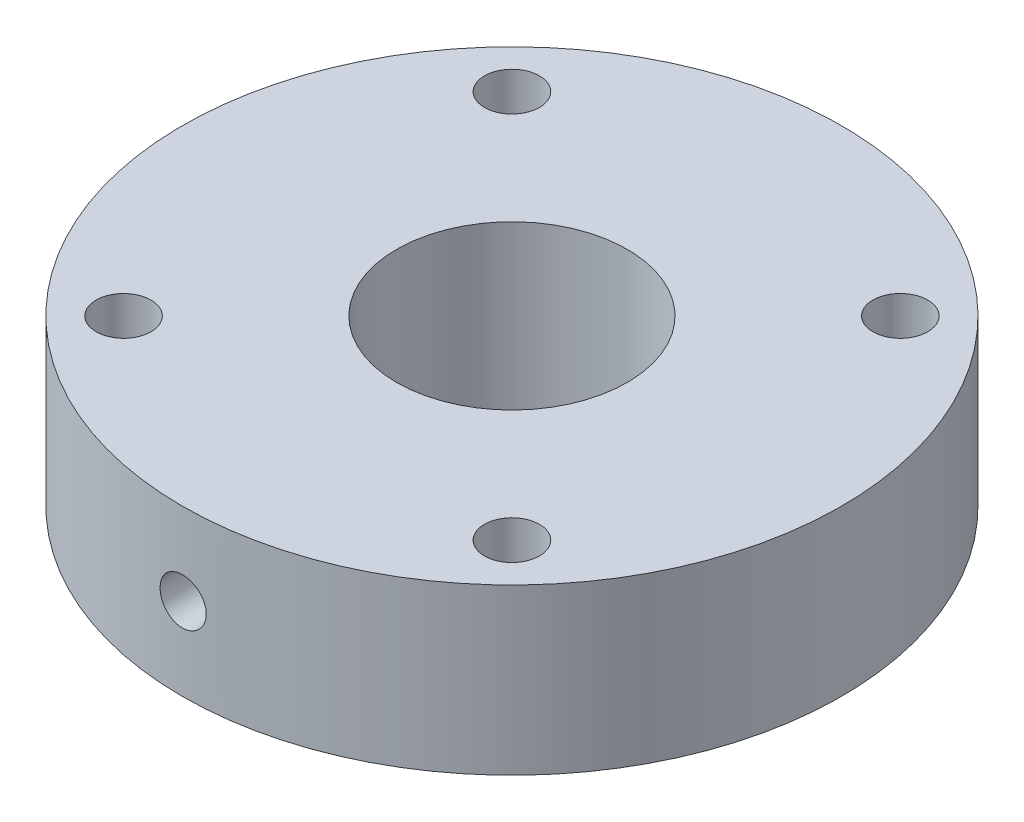
ISO-10303-21;
HEADER;
FILE_DESCRIPTION(('STEP AP214'),'2;1');
FILE_NAME('part.step','',(''),(''),'','','');
FILE_SCHEMA(('AUTOMOTIVE_DESIGN { 1 0 10303 214 1 1 1 1 }'));
ENDSEC;
DATA;
#1=APPLICATION_CONTEXT('core data for automotive mechanical design processes');
#2=APPLICATION_PROTOCOL_DEFINITION('international standard','automotive_design',2000,#1);
#3=PRODUCT_CONTEXT('',#1,'mechanical');
#4=PRODUCT('Part','Part','',(#3));
#5=PRODUCT_RELATED_PRODUCT_CATEGORY('part','',(#4));
#6=PRODUCT_DEFINITION_FORMATION('','',#4);
#7=PRODUCT_DEFINITION_CONTEXT('part definition',#1,'design');
#8=PRODUCT_DEFINITION('design','',#6,#7);
#9=PRODUCT_DEFINITION_SHAPE('','',#8);
#10=(LENGTH_UNIT() NAMED_UNIT(*) SI_UNIT(.MILLI.,.METRE.));
#11=(NAMED_UNIT(*) PLANE_ANGLE_UNIT() SI_UNIT($,.RADIAN.));
#12=(NAMED_UNIT(*) SI_UNIT($,.STERADIAN.) SOLID_ANGLE_UNIT());
#13=UNCERTAINTY_MEASURE_WITH_UNIT(LENGTH_MEASURE(1.E-05),#10,'distance_accuracy_value','');
#14=(GEOMETRIC_REPRESENTATION_CONTEXT(3) GLOBAL_UNCERTAINTY_ASSIGNED_CONTEXT((#13)) GLOBAL_UNIT_ASSIGNED_CONTEXT((#10,
#11,#12)) REPRESENTATION_CONTEXT('',''));
#15=CARTESIAN_POINT('',(0.,0.,0.));
#16=DIRECTION('',(0.,0.,1.));
#17=DIRECTION('',(1.,0.,0.));
#18=AXIS2_PLACEMENT_3D('',#15,#16,#17);
#19=CARTESIAN_POINT('',(0.,-7.5,0.));
#20=DIRECTION('',(0.,1.,0.));
#21=DIRECTION('',(0.,0.,1.));
#22=AXIS2_PLACEMENT_3D('',#19,#20,#21);
#23=CYLINDRICAL_SURFACE('',#22,30.);
#24=CARTESIAN_POINT('',(0.,-7.5,0.));
#25=DIRECTION('',(0.,1.,0.));
#26=DIRECTION('',(0.,0.,1.));
#27=AXIS2_PLACEMENT_3D('',#24,#25,#26);
#28=CIRCLE('',#27,30.);
#29=CARTESIAN_POINT('',(0.,-7.5,30.));
#30=VERTEX_POINT('',#29);
#31=EDGE_CURVE('E42',#30,#30,#28,.T.);
#32=ORIENTED_EDGE('',*,*,#31,.T.);
#33=EDGE_LOOP('',(#32));
#34=FACE_BOUND('',#33,.T.);
#35=CARTESIAN_POINT('',(0.,7.5,0.));
#36=DIRECTION('',(0.,1.,0.));
#37=DIRECTION('',(0.,0.,1.));
#38=AXIS2_PLACEMENT_3D('',#35,#36,#37);
#39=CIRCLE('',#38,30.);
#40=CARTESIAN_POINT('',(0.,7.5,30.));
#41=VERTEX_POINT('',#40);
#42=EDGE_CURVE('E64',#41,#41,#39,.T.);
#43=ORIENTED_EDGE('',*,*,#42,.F.);
#44=EDGE_LOOP('',(#43));
#45=FACE_BOUND('',#44,.T.);
#46=CARTESIAN_POINT('',(0.,-2.1,30.));
#47=CARTESIAN_POINT('',(-0.117803178986411,-2.09999482846397,29.9999990274452));
#48=CARTESIAN_POINT('',(-0.235688094827203,-2.09005411601089,29.9992987075929));
#49=CARTESIAN_POINT('',(-0.468200707675411,-2.05054253255947,29.9965723223763));
#50=CARTESIAN_POINT('',(-0.58282448725095,-2.02094901264032,29.9945447274294));
#51=CARTESIAN_POINT('',(-0.805413362338619,-1.94298787930603,29.9893930865757));
#52=CARTESIAN_POINT('',(-0.913382017628727,-1.89463040537348,29.9862696329256));
#53=CARTESIAN_POINT('',(-1.11964236487002,-1.78053106859355,29.9792772407048));
#54=CARTESIAN_POINT('',(-1.21793621827089,-1.71479310087887,29.9754084692196));
#55=CARTESIAN_POINT('',(-1.40226526810212,-1.56766698341836,29.9673520965292));
#56=CARTESIAN_POINT('',(-1.4882802442418,-1.4862535261174,29.9631639864576));
#57=CARTESIAN_POINT('',(-1.6454367306086,-1.31014020896081,29.9549452789314));
#58=CARTESIAN_POINT('',(-1.71657760916024,-1.21543978511752,29.9509146881723));
#59=CARTESIAN_POINT('',(-1.84203140688198,-1.01532283887428,29.943461524507));
#60=CARTESIAN_POINT('',(-1.89632711532337,-0.909895501818837,29.940039574963));
#61=CARTESIAN_POINT('',(-1.9864392798668,-0.691393079415837,29.9341963294454));
#62=CARTESIAN_POINT('',(-2.02225597627088,-0.578318093540339,29.9317750204595));
#63=CARTESIAN_POINT('',(-2.07433620505406,-0.347928384543231,29.9282110510197));
#64=CARTESIAN_POINT('',(-2.09063196901287,-0.230620980589052,29.9270662830485));
#65=CARTESIAN_POINT('',(-2.10330728103662,0.00506928606338171,29.9261781869986));
#66=CARTESIAN_POINT('',(-2.09968710307453,0.123452133944963,29.9264348396414));
#67=CARTESIAN_POINT('',(-2.07265999967399,0.357712802815507,29.928318686457));
#68=CARTESIAN_POINT('',(-2.04928800064538,0.473594675494107,29.9299434614117));
#69=CARTESIAN_POINT('',(-1.98347490364268,0.699786489261049,29.9343766581533));
#70=CARTESIAN_POINT('',(-1.94103366775037,0.810096390043695,29.937185088501));
#71=CARTESIAN_POINT('',(-1.83824737522041,1.02212488735455,29.9436719091809));
#72=CARTESIAN_POINT('',(-1.77788653178335,1.12383580642316,29.9473510660229));
#73=CARTESIAN_POINT('',(-1.64098586413064,1.31569520187933,29.9551640026536));
#74=CARTESIAN_POINT('',(-1.56444581026813,1.40584351411868,29.959297788895));
#75=CARTESIAN_POINT('',(-1.39716297009164,1.57222188061692,29.9675649138381));
#76=CARTESIAN_POINT('',(-1.30638996794287,1.64842155909104,29.9716982324249));
#77=CARTESIAN_POINT('',(-1.11332370045804,1.78450514606215,29.9794901275198));
#78=CARTESIAN_POINT('',(-1.0110304300616,1.84438904739227,29.9831487038195));
#79=CARTESIAN_POINT('',(-0.797808497926039,1.94613884890698,29.9895792792468));
#80=CARTESIAN_POINT('',(-0.686879254834172,1.98800353484102,29.992351218624));
#81=CARTESIAN_POINT('',(-0.459542750317307,2.05250591151822,29.9966954198086));
#82=CARTESIAN_POINT('',(-0.343135569140704,2.07514388382832,29.9982676991845));
#83=CARTESIAN_POINT('',(-0.108411024706552,2.10051244007976,30.0000331579938));
#84=CARTESIAN_POINT('',(0.00990178007666673,2.10328500811171,30.0002292458901));
#85=CARTESIAN_POINT('',(0.245310690052256,2.0889538442311,29.9992279732811));
#86=CARTESIAN_POINT('',(0.362406803207604,2.07185024248646,29.9980306219015));
#87=CARTESIAN_POINT('',(0.59193966021914,2.01828702182535,29.994379088203));
#88=CARTESIAN_POINT('',(0.704380935867341,1.98184673010628,29.9919261609302));
#89=CARTESIAN_POINT('',(0.921552363946561,1.89066420009978,29.9860393006282));
#90=CARTESIAN_POINT('',(1.02628242960686,1.83592175590499,29.9826053565623));
#91=CARTESIAN_POINT('',(1.22525040694042,1.70958242891501,29.9751347606506));
#92=CARTESIAN_POINT('',(1.31947052281728,1.63795757983816,29.9710971128512));
#93=CARTESIAN_POINT('',(1.49456473103228,1.47992721439327,29.9628766048923));
#94=CARTESIAN_POINT('',(1.57543865931093,1.39352151635659,29.9586937429485));
#95=CARTESIAN_POINT('',(1.72168758888798,1.20820071029253,29.9506457507945));
#96=CARTESIAN_POINT('',(1.78703530025518,1.10926403796807,29.9467811877218));
#97=CARTESIAN_POINT('',(1.90019000199937,0.90179776377203,29.9398147214326));
#98=CARTESIAN_POINT('',(1.94799712272162,0.793268233193034,29.9367128125489));
#99=CARTESIAN_POINT('',(2.02466656680364,0.569795676364799,29.931625590919));
#100=CARTESIAN_POINT('',(2.05354591190659,0.454858513727345,29.9296392751509));
#101=CARTESIAN_POINT('',(2.09159556284207,0.221752271236579,29.9270044845675));
#102=CARTESIAN_POINT('',(2.10076612379687,0.103583233238646,29.9263559924345));
#103=CARTESIAN_POINT('',(2.09913529144549,-0.132361098580891,29.9264704078695));
#104=CARTESIAN_POINT('',(2.08837679130387,-0.250136692739883,29.9272302842189));
#105=CARTESIAN_POINT('',(2.04728233084748,-0.482204501900148,29.9300693846179));
#106=CARTESIAN_POINT('',(2.01694633665305,-0.596496710872919,29.9321486109507));
#107=CARTESIAN_POINT('',(1.93756811325083,-0.818358569886694,29.9373913527567));
#108=CARTESIAN_POINT('',(1.88852627682436,-0.925928361028414,29.9405548454626));
#109=CARTESIAN_POINT('',(1.77313388776121,-1.13131368576366,29.9476096351955));
#110=CARTESIAN_POINT('',(1.70678372536457,-1.22912943920669,29.9515009158129));
#111=CARTESIAN_POINT('',(1.55849814624957,-1.41244856616789,29.9595826519102));
#112=CARTESIAN_POINT('',(1.47653136204724,-1.49792654010909,29.963773698732));
#113=CARTESIAN_POINT('',(1.29938830636163,-1.65394115926122,29.9719774852366));
#114=CARTESIAN_POINT('',(1.20420881988277,-1.72447415738434,29.9759901812073));
#115=CARTESIAN_POINT('',(1.00320958450248,-1.8486622846613,29.9833902691363));
#116=CARTESIAN_POINT('',(0.8973747297825,-1.9022929943959,29.9867767534909));
#117=CARTESIAN_POINT('',(0.678254266198738,-1.99095671773887,29.9925312900816));
#118=CARTESIAN_POINT('',(0.564977504413282,-2.02601138080804,29.9949005272548));
#119=CARTESIAN_POINT('',(0.375846358812104,-2.06747668743488,29.9977368692166));
#120=CARTESIAN_POINT('',(0.301212586451287,-2.0796570160531,29.9985817416758));
#121=CARTESIAN_POINT('',(0.15106374731554,-2.0959203234192,29.9997136184271));
#122=CARTESIAN_POINT('',(0.07554868210865,-2.10000331657206,30.0000006237118));
#123=CARTESIAN_POINT('',(0.,-2.1,30.));
#124=B_SPLINE_CURVE_WITH_KNOTS('',3,(#46,#47,#48,#49,#50,#51,#52,#53,#54,#55,#56,#57,#58,#59,
#60,#61,#62,#63,#64,#65,#66,#67,#68,#69,#70,#71,#72,#73,#74,#75,#76,#77,#78,#79,#80,#81,#82,#83,
#84,#85,#86,#87,#88,#89,#90,#91,#92,#93,#94,#95,#96,#97,#98,#99,#100,#101,#102,#103,#104,#105,
#106,#107,#108,#109,#110,#111,#112,#113,#114,#115,#116,#117,#118,#119,#120,#121,#122,#123),
.UNSPECIFIED.,.T.,.F.,(4,2,2,2,2,2,2,2,2,2,2,2,2,2,2,2,2,2,2,2,2,2,2,2,2,2,2,2,2,2,2,2,2,2,2,2,
2,2,4),(0.,0.353133727288799,0.706675132200995,1.06002575930838,1.41329726423078,
1.76714397044976,2.1210057008342,2.47522779049303,2.82944527371294,3.18307708843237,
3.53670403843995,3.88970698828506,4.24271249126448,4.59602991226951,4.9493523485801,
5.3034352880773,5.65751838310861,6.01162533480044,6.36572710065892,6.71908027678504,
7.07243113883431,7.4254294868918,7.77843180647159,8.13202304791517,8.48561863559467,
8.83983120366947,9.19404113951448,9.54793209578965,9.90181847106113,10.2549440642378,
10.6080702685146,10.9611890583301,11.3142998872843,11.6681275967003,12.0220415530454,
12.3764645038068,12.7304734786609,12.95694304761,13.1834122136744),.UNSPECIFIED.);
#125=CARTESIAN_POINT('',(0.,-2.1,30.));
#126=VERTEX_POINT('',#125);
#127=EDGE_CURVE('E10',#126,#126,#124,.T.);
#128=ORIENTED_EDGE('',*,*,#127,.T.);
#129=EDGE_LOOP('',(#128));
#130=FACE_BOUND('',#129,.T.);
#131=ADVANCED_FACE('F31',(#34,#45,#130),#23,.T.);
#132=CARTESIAN_POINT('',(0.,-7.5,0.));
#133=DIRECTION('',(0.,1.,0.));
#134=DIRECTION('',(0.,0.,1.));
#135=AXIS2_PLACEMENT_3D('',#132,#133,#134);
#136=PLANE('',#135);
#137=CARTESIAN_POINT('',(-17.6776695296638,-7.5,-17.6776695296636));
#138=DIRECTION('',(0.,1.,0.));
#139=DIRECTION('',(0.,0.,1.));
#140=AXIS2_PLACEMENT_3D('',#137,#138,#139);
#141=CIRCLE('',#140,2.5);
#142=CARTESIAN_POINT('',(-17.6776695296638,-7.5,-15.1776695296636));
#143=VERTEX_POINT('',#142);
#144=EDGE_CURVE('E61',#143,#143,#141,.T.);
#145=ORIENTED_EDGE('',*,*,#144,.T.);
#146=EDGE_LOOP('',(#145));
#147=FACE_BOUND('',#146,.T.);
#148=CARTESIAN_POINT('',(-17.6776695296636,-7.5,17.6776695296638));
#149=DIRECTION('',(0.,1.,0.));
#150=DIRECTION('',(0.,0.,1.));
#151=AXIS2_PLACEMENT_3D('',#148,#149,#150);
#152=CIRCLE('',#151,2.5);
#153=CARTESIAN_POINT('',(-17.6776695296636,-7.5,20.1776695296638));
#154=VERTEX_POINT('',#153);
#155=EDGE_CURVE('E58',#154,#154,#152,.T.);
#156=ORIENTED_EDGE('',*,*,#155,.T.);
#157=EDGE_LOOP('',(#156));
#158=FACE_BOUND('',#157,.T.);
#159=CARTESIAN_POINT('',(17.6776695296638,-7.5,17.6776695296636));
#160=DIRECTION('',(0.,1.,0.));
#161=DIRECTION('',(0.,0.,1.));
#162=AXIS2_PLACEMENT_3D('',#159,#160,#161);
#163=CIRCLE('',#162,2.5);
#164=CARTESIAN_POINT('',(17.6776695296638,-7.5,20.1776695296636));
#165=VERTEX_POINT('',#164);
#166=EDGE_CURVE('E55',#165,#165,#163,.T.);
#167=ORIENTED_EDGE('',*,*,#166,.T.);
#168=EDGE_LOOP('',(#167));
#169=FACE_BOUND('',#168,.T.);
#170=CARTESIAN_POINT('',(17.6776695296636,-7.5,-17.6776695296638));
#171=DIRECTION('',(0.,1.,0.));
#172=DIRECTION('',(0.,0.,1.));
#173=AXIS2_PLACEMENT_3D('',#170,#171,#172);
#174=CIRCLE('',#173,2.5);
#175=CARTESIAN_POINT('',(17.6776695296636,-7.5,-15.1776695296638));
#176=VERTEX_POINT('',#175);
#177=EDGE_CURVE('E50',#176,#176,#174,.T.);
#178=ORIENTED_EDGE('',*,*,#177,.T.);
#179=EDGE_LOOP('',(#178));
#180=FACE_BOUND('',#179,.T.);
#181=CARTESIAN_POINT('',(0.,-7.5,0.));
#182=DIRECTION('',(0.,1.,0.));
#183=DIRECTION('',(0.,0.,1.));
#184=AXIS2_PLACEMENT_3D('',#181,#182,#183);
#185=CIRCLE('',#184,10.5);
#186=CARTESIAN_POINT('',(0.,-7.5,10.5));
#187=VERTEX_POINT('',#186);
#188=EDGE_CURVE('E46',#187,#187,#185,.T.);
#189=ORIENTED_EDGE('',*,*,#188,.T.);
#190=EDGE_LOOP('',(#189));
#191=FACE_BOUND('',#190,.T.);
#192=ORIENTED_EDGE('',*,*,#31,.F.);
#193=EDGE_LOOP('',(#192));
#194=FACE_BOUND('',#193,.T.);
#195=ADVANCED_FACE('F102',(#147,#158,#169,#180,#191,#194),#136,.F.);
#196=CARTESIAN_POINT('',(0.,-7.5,0.));
#197=DIRECTION('',(0.,1.,0.));
#198=DIRECTION('',(0.,0.,1.));
#199=AXIS2_PLACEMENT_3D('',#196,#197,#198);
#200=CYLINDRICAL_SURFACE('',#199,10.5);
#201=ORIENTED_EDGE('',*,*,#188,.F.);
#202=EDGE_LOOP('',(#201));
#203=FACE_BOUND('',#202,.T.);
#204=CARTESIAN_POINT('',(0.,7.5,0.));
#205=DIRECTION('',(0.,1.,0.));
#206=DIRECTION('',(0.,0.,1.));
#207=AXIS2_PLACEMENT_3D('',#204,#205,#206);
#208=CIRCLE('',#207,10.5);
#209=CARTESIAN_POINT('',(0.,7.5,10.5));
#210=VERTEX_POINT('',#209);
#211=EDGE_CURVE('E67',#210,#210,#208,.T.);
#212=ORIENTED_EDGE('',*,*,#211,.T.);
#213=EDGE_LOOP('',(#212));
#214=FACE_BOUND('',#213,.T.);
#215=ADVANCED_FACE('F106',(#203,#214),#200,.F.);
#216=CARTESIAN_POINT('',(17.6776695296636,-7.5,-17.6776695296638));
#217=DIRECTION('',(0.,1.,0.));
#218=DIRECTION('',(0.,0.,1.));
#219=AXIS2_PLACEMENT_3D('',#216,#217,#218);
#220=CYLINDRICAL_SURFACE('',#219,2.5);
#221=ORIENTED_EDGE('',*,*,#177,.F.);
#222=EDGE_LOOP('',(#221));
#223=FACE_BOUND('',#222,.T.);
#224=CARTESIAN_POINT('',(17.6776695296636,7.5,-17.6776695296638));
#225=DIRECTION('',(0.,1.,0.));
#226=DIRECTION('',(0.,0.,1.));
#227=AXIS2_PLACEMENT_3D('',#224,#225,#226);
#228=CIRCLE('',#227,2.5);
#229=CARTESIAN_POINT('',(17.6776695296636,7.5,-15.1776695296638));
#230=VERTEX_POINT('',#229);
#231=EDGE_CURVE('E70',#230,#230,#228,.T.);
#232=ORIENTED_EDGE('',*,*,#231,.T.);
#233=EDGE_LOOP('',(#232));
#234=FACE_BOUND('',#233,.T.);
#235=ADVANCED_FACE('F132',(#223,#234),#220,.F.);
#236=CARTESIAN_POINT('',(17.6776695296638,-7.5,17.6776695296636));
#237=DIRECTION('',(0.,1.,0.));
#238=DIRECTION('',(0.,0.,1.));
#239=AXIS2_PLACEMENT_3D('',#236,#237,#238);
#240=CYLINDRICAL_SURFACE('',#239,2.5);
#241=ORIENTED_EDGE('',*,*,#166,.F.);
#242=EDGE_LOOP('',(#241));
#243=FACE_BOUND('',#242,.T.);
#244=CARTESIAN_POINT('',(17.6776695296638,7.5,17.6776695296636));
#245=DIRECTION('',(0.,1.,0.));
#246=DIRECTION('',(0.,0.,1.));
#247=AXIS2_PLACEMENT_3D('',#244,#245,#246);
#248=CIRCLE('',#247,2.5);
#249=CARTESIAN_POINT('',(17.6776695296638,7.5,20.1776695296636));
#250=VERTEX_POINT('',#249);
#251=EDGE_CURVE('E73',#250,#250,#248,.T.);
#252=ORIENTED_EDGE('',*,*,#251,.T.);
#253=EDGE_LOOP('',(#252));
#254=FACE_BOUND('',#253,.T.);
#255=ADVANCED_FACE('F125',(#243,#254),#240,.F.);
#256=CARTESIAN_POINT('',(-17.6776695296636,-7.5,17.6776695296638));
#257=DIRECTION('',(0.,1.,0.));
#258=DIRECTION('',(0.,0.,1.));
#259=AXIS2_PLACEMENT_3D('',#256,#257,#258);
#260=CYLINDRICAL_SURFACE('',#259,2.5);
#261=ORIENTED_EDGE('',*,*,#155,.F.);
#262=EDGE_LOOP('',(#261));
#263=FACE_BOUND('',#262,.T.);
#264=CARTESIAN_POINT('',(-17.6776695296636,7.5,17.6776695296638));
#265=DIRECTION('',(0.,1.,0.));
#266=DIRECTION('',(0.,0.,1.));
#267=AXIS2_PLACEMENT_3D('',#264,#265,#266);
#268=CIRCLE('',#267,2.5);
#269=CARTESIAN_POINT('',(-17.6776695296636,7.5,20.1776695296638));
#270=VERTEX_POINT('',#269);
#271=EDGE_CURVE('E76',#270,#270,#268,.T.);
#272=ORIENTED_EDGE('',*,*,#271,.T.);
#273=EDGE_LOOP('',(#272));
#274=FACE_BOUND('',#273,.T.);
#275=ADVANCED_FACE('F119',(#263,#274),#260,.F.);
#276=CARTESIAN_POINT('',(-17.6776695296638,-7.5,-17.6776695296636));
#277=DIRECTION('',(0.,1.,0.));
#278=DIRECTION('',(0.,0.,1.));
#279=AXIS2_PLACEMENT_3D('',#276,#277,#278);
#280=CYLINDRICAL_SURFACE('',#279,2.5);
#281=ORIENTED_EDGE('',*,*,#144,.F.);
#282=EDGE_LOOP('',(#281));
#283=FACE_BOUND('',#282,.T.);
#284=CARTESIAN_POINT('',(-17.6776695296638,7.5,-17.6776695296636));
#285=DIRECTION('',(0.,1.,0.));
#286=DIRECTION('',(0.,0.,1.));
#287=AXIS2_PLACEMENT_3D('',#284,#285,#286);
#288=CIRCLE('',#287,2.5);
#289=CARTESIAN_POINT('',(-17.6776695296638,7.5,-15.1776695296636));
#290=VERTEX_POINT('',#289);
#291=EDGE_CURVE('E79',#290,#290,#288,.T.);
#292=ORIENTED_EDGE('',*,*,#291,.T.);
#293=EDGE_LOOP('',(#292));
#294=FACE_BOUND('',#293,.T.);
#295=ADVANCED_FACE('F97',(#283,#294),#280,.F.);
#296=CARTESIAN_POINT('',(0.,7.5,0.));
#297=DIRECTION('',(0.,1.,0.));
#298=DIRECTION('',(0.,0.,1.));
#299=AXIS2_PLACEMENT_3D('',#296,#297,#298);
#300=PLANE('',#299);
#301=ORIENTED_EDGE('',*,*,#271,.F.);
#302=EDGE_LOOP('',(#301));
#303=FACE_BOUND('',#302,.T.);
#304=ORIENTED_EDGE('',*,*,#231,.F.);
#305=EDGE_LOOP('',(#304));
#306=FACE_BOUND('',#305,.T.);
#307=ORIENTED_EDGE('',*,*,#42,.T.);
#308=EDGE_LOOP('',(#307));
#309=FACE_BOUND('',#308,.T.);
#310=ORIENTED_EDGE('',*,*,#211,.F.);
#311=EDGE_LOOP('',(#310));
#312=FACE_BOUND('',#311,.T.);
#313=ORIENTED_EDGE('',*,*,#251,.F.);
#314=EDGE_LOOP('',(#313));
#315=FACE_BOUND('',#314,.T.);
#316=ORIENTED_EDGE('',*,*,#291,.F.);
#317=EDGE_LOOP('',(#316));
#318=FACE_BOUND('',#317,.T.);
#319=ADVANCED_FACE('F90',(#303,#306,#309,#312,#315,#318),#300,.T.);
#320=CARTESIAN_POINT('',(0.,0.,30.));
#321=DIRECTION('',(0.,0.,-1.));
#322=DIRECTION('',(-1.,0.,0.));
#323=AXIS2_PLACEMENT_3D('',#320,#321,#322);
#324=CYLINDRICAL_SURFACE('',#323,2.1);
#325=ORIENTED_EDGE('',*,*,#127,.F.);
#326=EDGE_LOOP('',(#325));
#327=FACE_BOUND('',#326,.T.);
#328=CARTESIAN_POINT('',(0.,0.,20.));
#329=DIRECTION('',(0.,0.,1.));
#330=DIRECTION('',(1.,0.,0.));
#331=AXIS2_PLACEMENT_3D('',#328,#329,#330);
#332=CIRCLE('',#331,2.1);
#333=CARTESIAN_POINT('',(2.1,0.,20.));
#334=VERTEX_POINT('',#333);
#335=EDGE_CURVE('E82',#334,#334,#332,.T.);
#336=ORIENTED_EDGE('',*,*,#335,.F.);
#337=EDGE_LOOP('',(#336));
#338=FACE_BOUND('',#337,.T.);
#339=ADVANCED_FACE('F88',(#327,#338),#324,.F.);
#340=CARTESIAN_POINT('',(0.,0.,20.));
#341=DIRECTION('',(0.,0.,1.));
#342=DIRECTION('',(1.,0.,0.));
#343=AXIS2_PLACEMENT_3D('',#340,#341,#342);
#344=PLANE('',#343);
#345=ORIENTED_EDGE('',*,*,#335,.T.);
#346=EDGE_LOOP('',(#345));
#347=FACE_BOUND('',#346,.T.);
#348=ADVANCED_FACE('F86',(#347),#344,.T.);
#349=CLOSED_SHELL('',(#131,#195,#215,#235,#255,#275,#295,#319,#339,#348));
#350=MANIFOLD_SOLID_BREP('B2',#349);
#351=ADVANCED_BREP_SHAPE_REPRESENTATION('',(#18,#350),#14);
#352=SHAPE_DEFINITION_REPRESENTATION(#9,#351);
ENDSEC;
END-ISO-10303-21;
